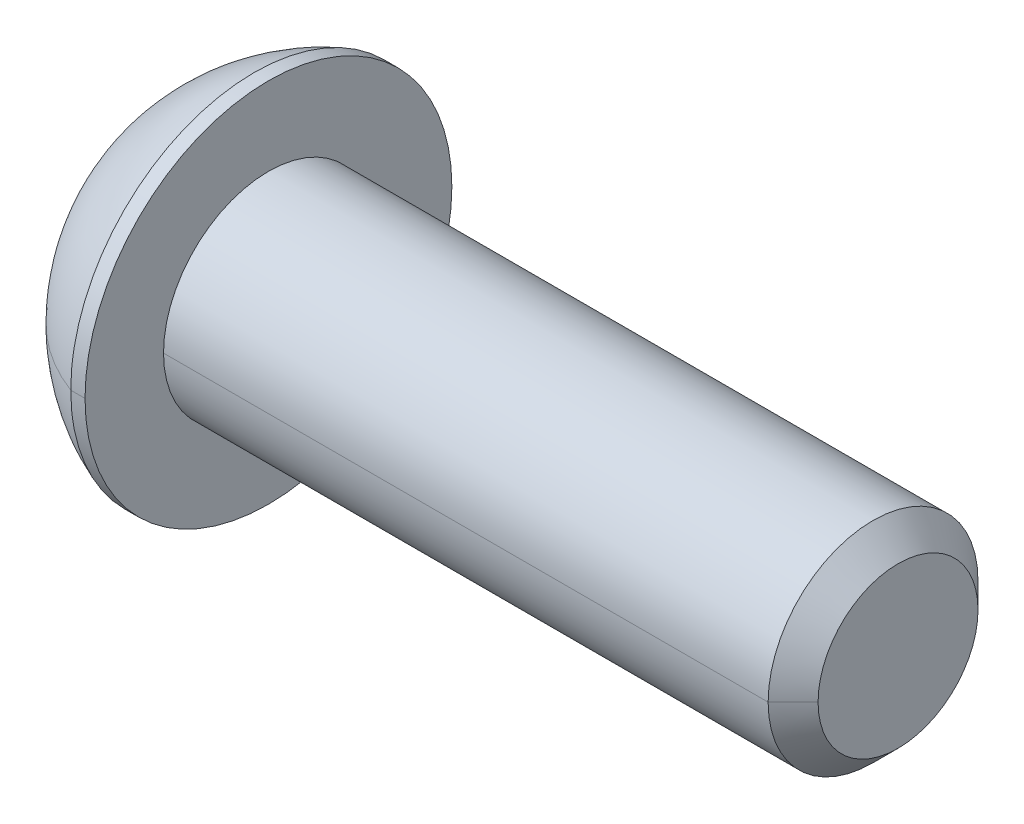
ISO-10303-21;
HEADER;
FILE_DESCRIPTION(('STEP AP214'),'2;1');
FILE_NAME('part.step','',(''),(''),'','','');
FILE_SCHEMA(('AUTOMOTIVE_DESIGN { 1 0 10303 214 1 1 1 1 }'));
ENDSEC;
DATA;
#1=APPLICATION_CONTEXT('core data for automotive mechanical design processes');
#2=APPLICATION_PROTOCOL_DEFINITION('international standard','automotive_design',2000,#1);
#3=PRODUCT_CONTEXT('',#1,'mechanical');
#4=PRODUCT('Part','Part','',(#3));
#5=PRODUCT_RELATED_PRODUCT_CATEGORY('part','',(#4));
#6=PRODUCT_DEFINITION_FORMATION('','',#4);
#7=PRODUCT_DEFINITION_CONTEXT('part definition',#1,'design');
#8=PRODUCT_DEFINITION('design','',#6,#7);
#9=PRODUCT_DEFINITION_SHAPE('','',#8);
#10=(LENGTH_UNIT() NAMED_UNIT(*) SI_UNIT(.MILLI.,.METRE.));
#11=(NAMED_UNIT(*) PLANE_ANGLE_UNIT() SI_UNIT($,.RADIAN.));
#12=(NAMED_UNIT(*) SI_UNIT($,.STERADIAN.) SOLID_ANGLE_UNIT());
#13=UNCERTAINTY_MEASURE_WITH_UNIT(LENGTH_MEASURE(1.E-05),#10,'distance_accuracy_value','');
#14=(GEOMETRIC_REPRESENTATION_CONTEXT(3) GLOBAL_UNCERTAINTY_ASSIGNED_CONTEXT((#13)) GLOBAL_UNIT_ASSIGNED_CONTEXT((#10,
#11,#12)) REPRESENTATION_CONTEXT('',''));
#15=CARTESIAN_POINT('',(0.,0.,0.));
#16=DIRECTION('',(0.,0.,1.));
#17=DIRECTION('',(1.,0.,0.));
#18=AXIS2_PLACEMENT_3D('',#15,#16,#17);
#19=CARTESIAN_POINT('',(-1.1303,0.,-2.2913588808463));
#20=DIRECTION('',(0.,-0.499999999999979,0.866025403784451));
#21=DIRECTION('',(0.,-0.866025403784451,-0.499999999999979));
#22=AXIS2_PLACEMENT_3D('',#19,#20,#21);
#23=PLANE('',#22);
#24=DIRECTION('',(0.,-0.866025403784451,-0.499999999999979));
#25=VECTOR('',#24,1.);
#26=CARTESIAN_POINT('',(-3.3528,0.992187499999962,-1.71851916063477));
#27=LINE('',#26,#25);
#28=CARTESIAN_POINT('',(-3.3528,1.984375,-1.1456794404232));
#29=VERTEX_POINT('',#28);
#30=CARTESIAN_POINT('',(-3.3528,0.,-2.2913588808463));
#31=VERTEX_POINT('',#30);
#32=EDGE_CURVE('E11',#29,#31,#27,.T.);
#33=ORIENTED_EDGE('',*,*,#32,.T.);
#34=DIRECTION('',(-1.,0.,0.));
#35=VECTOR('',#34,1.);
#36=CARTESIAN_POINT('',(-1.1303,0.,-2.2913588808463));
#37=LINE('',#36,#35);
#38=CARTESIAN_POINT('',(-1.1303,0.,-2.2913588808463));
#39=VERTEX_POINT('',#38);
#40=EDGE_CURVE('E25',#39,#31,#37,.T.);
#41=ORIENTED_EDGE('',*,*,#40,.F.);
#42=DIRECTION('',(0.,0.866025403784451,0.499999999999979));
#43=VECTOR('',#42,1.);
#44=CARTESIAN_POINT('',(-1.1303,0.,-2.2913588808463));
#45=LINE('',#44,#43);
#46=CARTESIAN_POINT('',(-1.1303,1.984375,-1.1456794404232));
#47=VERTEX_POINT('',#46);
#48=EDGE_CURVE('E326',#39,#47,#45,.T.);
#49=ORIENTED_EDGE('',*,*,#48,.T.);
#50=DIRECTION('',(-1.,0.,0.));
#51=VECTOR('',#50,1.);
#52=CARTESIAN_POINT('',(-1.1303,1.984375,-1.1456794404232));
#53=LINE('',#52,#51);
#54=EDGE_CURVE('E322',#47,#29,#53,.T.);
#55=ORIENTED_EDGE('',*,*,#54,.T.);
#56=EDGE_LOOP('',(#33,#41,#49,#55));
#57=FACE_BOUND('',#56,.T.);
#58=ADVANCED_FACE('F17',(#57),#23,.T.);
#59=CARTESIAN_POINT('',(-1.1303,1.984375,-1.1456794404232));
#60=DIRECTION('',(0.,-1.,0.));
#61=DIRECTION('',(0.,0.,-1.));
#62=AXIS2_PLACEMENT_3D('',#59,#60,#61);
#63=PLANE('',#62);
#64=DIRECTION('',(-1.,0.,0.));
#65=VECTOR('',#64,1.);
#66=CARTESIAN_POINT('',(-1.1303,1.984375,1.1456794404232));
#67=LINE('',#66,#65);
#68=CARTESIAN_POINT('',(-1.1303,1.984375,1.1456794404232));
#69=VERTEX_POINT('',#68);
#70=CARTESIAN_POINT('',(-3.3528,1.984375,1.1456794404232));
#71=VERTEX_POINT('',#70);
#72=EDGE_CURVE('E318',#69,#71,#67,.T.);
#73=ORIENTED_EDGE('',*,*,#72,.T.);
#74=DIRECTION('',(0.,0.,-1.));
#75=VECTOR('',#74,1.);
#76=CARTESIAN_POINT('',(-3.3528,1.984375,0.));
#77=LINE('',#76,#75);
#78=EDGE_CURVE('E313',#71,#29,#77,.T.);
#79=ORIENTED_EDGE('',*,*,#78,.T.);
#80=ORIENTED_EDGE('',*,*,#54,.F.);
#81=DIRECTION('',(0.,0.,1.));
#82=VECTOR('',#81,1.);
#83=CARTESIAN_POINT('',(-1.1303,1.984375,-1.1456794404232));
#84=LINE('',#83,#82);
#85=EDGE_CURVE('E309',#47,#69,#84,.T.);
#86=ORIENTED_EDGE('',*,*,#85,.T.);
#87=EDGE_LOOP('',(#73,#79,#80,#86));
#88=FACE_BOUND('',#87,.T.);
#89=ADVANCED_FACE('F359',(#88),#63,.T.);
#90=CARTESIAN_POINT('',(-1.1303,0.,0.));
#91=DIRECTION('',(1.,0.,0.));
#92=DIRECTION('',(0.,0.,-1.));
#93=AXIS2_PLACEMENT_3D('',#90,#91,#92);
#94=PLANE('',#93);
#95=DIRECTION('',(0.,-0.866025403784451,0.499999999999979));
#96=VECTOR('',#95,1.);
#97=CARTESIAN_POINT('',(-1.1303,1.984375,1.1456794404232));
#98=LINE('',#97,#96);
#99=CARTESIAN_POINT('',(-1.1303,0.,2.2913588808463));
#100=VERTEX_POINT('',#99);
#101=EDGE_CURVE('E304',#69,#100,#98,.T.);
#102=ORIENTED_EDGE('',*,*,#101,.F.);
#103=ORIENTED_EDGE('',*,*,#85,.F.);
#104=ORIENTED_EDGE('',*,*,#48,.F.);
#105=DIRECTION('',(0.,0.866025403784451,-0.499999999999979));
#106=VECTOR('',#105,1.);
#107=CARTESIAN_POINT('',(-1.1303,-1.984375,-1.1456794404232));
#108=LINE('',#107,#106);
#109=CARTESIAN_POINT('',(-1.1303,-1.984375,-1.1456794404232));
#110=VERTEX_POINT('',#109);
#111=EDGE_CURVE('E299',#110,#39,#108,.T.);
#112=ORIENTED_EDGE('',*,*,#111,.F.);
#113=DIRECTION('',(0.,0.,-1.));
#114=VECTOR('',#113,1.);
#115=CARTESIAN_POINT('',(-1.1303,-1.984375,1.1456794404232));
#116=LINE('',#115,#114);
#117=CARTESIAN_POINT('',(-1.1303,-1.984375,1.1456794404232));
#118=VERTEX_POINT('',#117);
#119=EDGE_CURVE('E294',#118,#110,#116,.T.);
#120=ORIENTED_EDGE('',*,*,#119,.F.);
#121=DIRECTION('',(0.,-0.866025403784451,-0.499999999999979));
#122=VECTOR('',#121,1.);
#123=CARTESIAN_POINT('',(-1.1303,0.,2.2913588808463));
#124=LINE('',#123,#122);
#125=EDGE_CURVE('E289',#100,#118,#124,.T.);
#126=ORIENTED_EDGE('',*,*,#125,.F.);
#127=EDGE_LOOP('',(#102,#103,#104,#112,#120,#126));
#128=FACE_BOUND('',#127,.T.);
#129=ADVANCED_FACE('F349',(#128),#94,.F.);
#130=CARTESIAN_POINT('',(-1.1303,0.,2.2913588808463));
#131=DIRECTION('',(0.,0.499999999999979,-0.866025403784451));
#132=DIRECTION('',(0.,0.866025403784451,0.499999999999979));
#133=AXIS2_PLACEMENT_3D('',#130,#131,#132);
#134=PLANE('',#133);
#135=DIRECTION('',(0.,0.866025403784451,0.499999999999979));
#136=VECTOR('',#135,1.);
#137=CARTESIAN_POINT('',(-3.3528,-0.992187499999962,1.71851916063477));
#138=LINE('',#137,#136);
#139=CARTESIAN_POINT('',(-3.3528,-1.984375,1.1456794404232));
#140=VERTEX_POINT('',#139);
#141=CARTESIAN_POINT('',(-3.3528,0.,2.2913588808463));
#142=VERTEX_POINT('',#141);
#143=EDGE_CURVE('E285',#140,#142,#138,.T.);
#144=ORIENTED_EDGE('',*,*,#143,.T.);
#145=DIRECTION('',(-1.,0.,0.));
#146=VECTOR('',#145,1.);
#147=CARTESIAN_POINT('',(-1.1303,0.,2.2913588808463));
#148=LINE('',#147,#146);
#149=EDGE_CURVE('E280',#100,#142,#148,.T.);
#150=ORIENTED_EDGE('',*,*,#149,.F.);
#151=ORIENTED_EDGE('',*,*,#125,.T.);
#152=DIRECTION('',(-1.,0.,0.));
#153=VECTOR('',#152,1.);
#154=CARTESIAN_POINT('',(-1.1303,-1.984375,1.1456794404232));
#155=LINE('',#154,#153);
#156=EDGE_CURVE('E276',#118,#140,#155,.T.);
#157=ORIENTED_EDGE('',*,*,#156,.T.);
#158=EDGE_LOOP('',(#144,#150,#151,#157));
#159=FACE_BOUND('',#158,.T.);
#160=ADVANCED_FACE('F352',(#159),#134,.T.);
#161=CARTESIAN_POINT('',(-1.1303,-1.984375,1.1456794404232));
#162=DIRECTION('',(0.,1.,0.));
#163=DIRECTION('',(0.,0.,1.));
#164=AXIS2_PLACEMENT_3D('',#161,#162,#163);
#165=PLANE('',#164);
#166=DIRECTION('',(0.,0.,1.));
#167=VECTOR('',#166,1.);
#168=CARTESIAN_POINT('',(-3.3528,-1.984375,0.));
#169=LINE('',#168,#167);
#170=CARTESIAN_POINT('',(-3.3528,-1.984375,-1.1456794404232));
#171=VERTEX_POINT('',#170);
#172=EDGE_CURVE('E271',#171,#140,#169,.T.);
#173=ORIENTED_EDGE('',*,*,#172,.T.);
#174=ORIENTED_EDGE('',*,*,#156,.F.);
#175=ORIENTED_EDGE('',*,*,#119,.T.);
#176=DIRECTION('',(-1.,0.,0.));
#177=VECTOR('',#176,1.);
#178=CARTESIAN_POINT('',(-1.1303,-1.984375,-1.1456794404232));
#179=LINE('',#178,#177);
#180=EDGE_CURVE('E267',#110,#171,#179,.T.);
#181=ORIENTED_EDGE('',*,*,#180,.T.);
#182=EDGE_LOOP('',(#173,#174,#175,#181));
#183=FACE_BOUND('',#182,.T.);
#184=ADVANCED_FACE('F346',(#183),#165,.T.);
#185=CARTESIAN_POINT('',(-1.1303,-1.984375,-1.1456794404232));
#186=DIRECTION('',(0.,0.499999999999979,0.866025403784451));
#187=DIRECTION('',(0.,-0.866025403784451,0.499999999999979));
#188=AXIS2_PLACEMENT_3D('',#185,#186,#187);
#189=PLANE('',#188);
#190=DIRECTION('',(0.,-0.866025403784451,0.499999999999979));
#191=VECTOR('',#190,1.);
#192=CARTESIAN_POINT('',(-3.3528,-0.992187499999962,-1.71851916063477));
#193=LINE('',#192,#191);
#194=EDGE_CURVE('E262',#31,#171,#193,.T.);
#195=ORIENTED_EDGE('',*,*,#194,.T.);
#196=ORIENTED_EDGE('',*,*,#180,.F.);
#197=ORIENTED_EDGE('',*,*,#111,.T.);
#198=ORIENTED_EDGE('',*,*,#40,.T.);
#199=EDGE_LOOP('',(#195,#196,#197,#198));
#200=FACE_BOUND('',#199,.T.);
#201=ADVANCED_FACE('F336',(#200),#189,.T.);
#202=CARTESIAN_POINT('',(-3.3528,0.,0.));
#203=DIRECTION('',(1.,0.,0.));
#204=DIRECTION('',(0.,0.,-1.));
#205=AXIS2_PLACEMENT_3D('',#202,#203,#204);
#206=PLANE('',#205);
#207=CARTESIAN_POINT('',(-3.3528,0.,0.));
#208=DIRECTION('',(1.,0.,0.));
#209=DIRECTION('',(0.,0.,-1.));
#210=AXIS2_PLACEMENT_3D('',#207,#208,#209);
#211=CIRCLE('',#210,3.175);
#212=CARTESIAN_POINT('',(-3.3528,0.,-3.175));
#213=VERTEX_POINT('',#212);
#214=CARTESIAN_POINT('',(-3.3528,0.,3.175));
#215=VERTEX_POINT('',#214);
#216=EDGE_CURVE('E258',#213,#215,#211,.T.);
#217=ORIENTED_EDGE('',*,*,#216,.F.);
#218=CARTESIAN_POINT('',(-3.3528,0.,0.));
#219=DIRECTION('',(1.,0.,0.));
#220=DIRECTION('',(0.,0.,-1.));
#221=AXIS2_PLACEMENT_3D('',#218,#219,#220);
#222=CIRCLE('',#221,3.175);
#223=EDGE_CURVE('E254',#215,#213,#222,.T.);
#224=ORIENTED_EDGE('',*,*,#223,.F.);
#225=EDGE_LOOP('',(#217,#224));
#226=FACE_BOUND('',#225,.T.);
#227=DIRECTION('',(0.,0.866025403784451,-0.499999999999979));
#228=VECTOR('',#227,1.);
#229=CARTESIAN_POINT('',(-3.3528,0.992187499999962,1.71851916063477));
#230=LINE('',#229,#228);
#231=EDGE_CURVE('E251',#142,#71,#230,.T.);
#232=ORIENTED_EDGE('',*,*,#231,.F.);
#233=ORIENTED_EDGE('',*,*,#143,.F.);
#234=ORIENTED_EDGE('',*,*,#172,.F.);
#235=ORIENTED_EDGE('',*,*,#194,.F.);
#236=ORIENTED_EDGE('',*,*,#32,.F.);
#237=ORIENTED_EDGE('',*,*,#78,.F.);
#238=EDGE_LOOP('',(#232,#233,#234,#235,#236,#237));
#239=FACE_BOUND('',#238,.T.);
#240=ADVANCED_FACE('F341',(#226,#239),#206,.F.);
#241=CARTESIAN_POINT('',(-1.1303,1.984375,1.1456794404232));
#242=DIRECTION('',(0.,-0.499999999999979,-0.866025403784451));
#243=DIRECTION('',(0.,0.866025403784451,-0.499999999999979));
#244=AXIS2_PLACEMENT_3D('',#241,#242,#243);
#245=PLANE('',#244);
#246=ORIENTED_EDGE('',*,*,#231,.T.);
#247=ORIENTED_EDGE('',*,*,#72,.F.);
#248=ORIENTED_EDGE('',*,*,#101,.T.);
#249=ORIENTED_EDGE('',*,*,#149,.T.);
#250=EDGE_LOOP('',(#246,#247,#248,#249));
#251=FACE_BOUND('',#250,.T.);
#252=ADVANCED_FACE('F355',(#251),#245,.T.);
#253=CARTESIAN_POINT('',(-0.431800000000002,0.,5.5499));
#254=CARTESIAN_POINT('',(-0.431800000000002,-11.0998,5.5499));
#255=CARTESIAN_POINT('',(-0.431800000000002,-11.0998,-5.5499));
#256=CARTESIAN_POINT('',(-0.4318,0.,-5.5499));
#257=CARTESIAN_POINT('',(-1.648820554803,0.,5.09324499015708));
#258=CARTESIAN_POINT('',(-1.648820554803,-10.1864899803141,5.09324499015708));
#259=CARTESIAN_POINT('',(-1.648820554803,-10.1864899803141,-5.09324499015708));
#260=CARTESIAN_POINT('',(-1.648820554803,0.,-5.09324499015708));
#261=CARTESIAN_POINT('',(-2.65740276644937,0.,4.27322380068806));
#262=CARTESIAN_POINT('',(-2.65740276644937,-8.54644760137615,4.27322380068806));
#263=CARTESIAN_POINT('',(-2.65740276644937,-8.54644760137615,-4.27322380068806));
#264=CARTESIAN_POINT('',(-2.65740276644937,0.,-4.27322380068806));
#265=CARTESIAN_POINT('',(-3.3528,0.,3.175));
#266=CARTESIAN_POINT('',(-3.3528,-6.35,3.175));
#267=CARTESIAN_POINT('',(-3.3528,-6.35,-3.175));
#268=CARTESIAN_POINT('',(-3.3528,0.,-3.175));
#269=(BOUNDED_SURFACE() B_SPLINE_SURFACE(3,3,((#253,#254,#255,#256),(#257,#258,#259,#260),(#261,
#262,#263,#264),(#265,#266,#267,#268)),.UNSPECIFIED.,.F.,.F.,
.F.) B_SPLINE_SURFACE_WITH_KNOTS((4,4),(4,4),(0.,6.2336188381791),(-54.0740870859098,
-28.4347442817813),
.UNSPECIFIED.) GEOMETRIC_REPRESENTATION_ITEM() RATIONAL_B_SPLINE_SURFACE(((1.,0.333333333333333,
0.333333333333333,1.),(0.965381557817974,0.321793852605991,0.321793852605991,0.965381557817974),
(0.965381557817974,0.321793852605991,0.321793852605991,0.965381557817974),(1.,0.333333333333333,
0.333333333333333,1.))) REPRESENTATION_ITEM('') SURFACE());
#270=CARTESIAN_POINT('',(-0.4318,0.,-5.5499));
#271=CARTESIAN_POINT('',(-1.648820554803,0.,-5.09324499015708));
#272=CARTESIAN_POINT('',(-2.65740276644937,0.,-4.27322380068806));
#273=CARTESIAN_POINT('',(-3.3528,0.,-3.175));
#274=(BOUNDED_CURVE() B_SPLINE_CURVE(3,(#270,#271,#272,#273),.UNSPECIFIED.,.F.,
.F.) B_SPLINE_CURVE_WITH_KNOTS((4,4),(0.,6.2336188381791),
.UNSPECIFIED.) CURVE() GEOMETRIC_REPRESENTATION_ITEM() RATIONAL_B_SPLINE_CURVE((1.,
0.965381557817974,0.965381557817974,1.)) REPRESENTATION_ITEM(''));
#275=CARTESIAN_POINT('',(-0.4318,0.,-5.5499));
#276=VERTEX_POINT('',#275);
#277=EDGE_CURVE('E219',#276,#213,#274,.T.);
#278=CARTESIAN_POINT('',(-0.4318,0.,0.));
#279=DIRECTION('',(1.,0.,0.));
#280=DIRECTION('',(0.,0.,-1.));
#281=AXIS2_PLACEMENT_3D('',#278,#279,#280);
#282=CIRCLE('',#281,5.5499);
#283=CARTESIAN_POINT('',(-0.431800000000003,0.,5.5499));
#284=VERTEX_POINT('',#283);
#285=EDGE_CURVE('E237',#284,#276,#282,.T.);
#286=CARTESIAN_POINT('',(-0.431800000000002,0.,5.5499));
#287=CARTESIAN_POINT('',(-1.648820554803,0.,5.09324499015708));
#288=CARTESIAN_POINT('',(-2.65740276644937,0.,4.27322380068806));
#289=CARTESIAN_POINT('',(-3.3528,0.,3.175));
#290=(BOUNDED_CURVE() B_SPLINE_CURVE(3,(#286,#287,#288,#289),.UNSPECIFIED.,.F.,
.F.) B_SPLINE_CURVE_WITH_KNOTS((4,4),(0.,6.2336188381791),
.UNSPECIFIED.) CURVE() GEOMETRIC_REPRESENTATION_ITEM() RATIONAL_B_SPLINE_CURVE((1.,
0.965381557817974,0.965381557817974,1.)) REPRESENTATION_ITEM(''));
#291=EDGE_CURVE('E222',#284,#215,#290,.T.);
#292=ORIENTED_EDGE('',*,*,#223,.T.);
#293=ORIENTED_EDGE('',*,*,#277,.F.);
#294=ORIENTED_EDGE('',*,*,#285,.F.);
#295=ORIENTED_EDGE('',*,*,#291,.T.);
#296=EDGE_LOOP('',(#292,#293,#294,#295));
#297=FACE_BOUND('',#296,.T.);
#298=ADVANCED_FACE('F194',(#297),#269,.T.);
#299=CARTESIAN_POINT('',(-0.4318,0.,-5.5499));
#300=CARTESIAN_POINT('',(-0.431800000000002,11.0998,-5.5499));
#301=CARTESIAN_POINT('',(-0.431800000000002,11.0998,5.5499));
#302=CARTESIAN_POINT('',(-0.431800000000002,0.,5.5499));
#303=CARTESIAN_POINT('',(-1.648820554803,0.,-5.09324499015708));
#304=CARTESIAN_POINT('',(-1.648820554803,10.1864899803141,-5.09324499015708));
#305=CARTESIAN_POINT('',(-1.648820554803,10.1864899803141,5.09324499015708));
#306=CARTESIAN_POINT('',(-1.648820554803,0.,5.09324499015708));
#307=CARTESIAN_POINT('',(-2.65740276644937,0.,-4.27322380068806));
#308=CARTESIAN_POINT('',(-2.65740276644937,8.54644760137615,-4.27322380068806));
#309=CARTESIAN_POINT('',(-2.65740276644937,8.54644760137615,4.27322380068806));
#310=CARTESIAN_POINT('',(-2.65740276644937,0.,4.27322380068806));
#311=CARTESIAN_POINT('',(-3.3528,0.,-3.175));
#312=CARTESIAN_POINT('',(-3.3528,6.35,-3.175));
#313=CARTESIAN_POINT('',(-3.3528,6.35,3.175));
#314=CARTESIAN_POINT('',(-3.3528,0.,3.175));
#315=(BOUNDED_SURFACE() B_SPLINE_SURFACE(3,3,((#299,#300,#301,#302),(#303,#304,#305,#306),(#307,
#308,#309,#310),(#311,#312,#313,#314)),.UNSPECIFIED.,.F.,.F.,
.F.) B_SPLINE_SURFACE_WITH_KNOTS((4,4),(4,4),(0.,6.2336188381791),(-79.7134298900382,
-54.0740870859098),
.UNSPECIFIED.) GEOMETRIC_REPRESENTATION_ITEM() RATIONAL_B_SPLINE_SURFACE(((1.,0.333333333333333,
0.333333333333333,1.),(0.965381557817974,0.321793852605991,0.321793852605991,0.965381557817974),
(0.965381557817974,0.321793852605991,0.321793852605991,0.965381557817974),(1.,0.333333333333333,
0.333333333333333,1.))) REPRESENTATION_ITEM('') SURFACE());
#316=CARTESIAN_POINT('',(-0.4318,0.,0.));
#317=DIRECTION('',(1.,0.,0.));
#318=DIRECTION('',(0.,0.,-1.));
#319=AXIS2_PLACEMENT_3D('',#316,#317,#318);
#320=CIRCLE('',#319,5.5499);
#321=EDGE_CURVE('E172',#276,#284,#320,.T.);
#322=ORIENTED_EDGE('',*,*,#321,.F.);
#323=ORIENTED_EDGE('',*,*,#277,.T.);
#324=ORIENTED_EDGE('',*,*,#216,.T.);
#325=ORIENTED_EDGE('',*,*,#291,.F.);
#326=EDGE_LOOP('',(#322,#323,#324,#325));
#327=FACE_BOUND('',#326,.T.);
#328=ADVANCED_FACE('F181',(#327),#315,.T.);
#329=CARTESIAN_POINT('',(19.05,0.,0.));
#330=DIRECTION('',(-1.,0.,0.));
#331=DIRECTION('',(0.,-1.,0.));
#332=AXIS2_PLACEMENT_3D('',#329,#330,#331);
#333=CYLINDRICAL_SURFACE('',#332,5.5499);
#334=CARTESIAN_POINT('',(0.,0.,0.));
#335=DIRECTION('',(1.,0.,0.));
#336=DIRECTION('',(0.,0.,-1.));
#337=AXIS2_PLACEMENT_3D('',#334,#335,#336);
#338=CIRCLE('',#337,5.5499);
#339=CARTESIAN_POINT('',(0.,0.,-5.5499));
#340=VERTEX_POINT('',#339);
#341=CARTESIAN_POINT('',(0.,0.,5.5499));
#342=VERTEX_POINT('',#341);
#343=EDGE_CURVE('E167',#340,#342,#338,.T.);
#344=ORIENTED_EDGE('',*,*,#343,.F.);
#345=DIRECTION('',(-1.,0.,0.));
#346=VECTOR('',#345,1.);
#347=CARTESIAN_POINT('',(0.,0.,-5.5499));
#348=LINE('',#347,#346);
#349=EDGE_CURVE('E162',#340,#276,#348,.T.);
#350=ORIENTED_EDGE('',*,*,#349,.T.);
#351=ORIENTED_EDGE('',*,*,#321,.T.);
#352=DIRECTION('',(-1.,0.,0.));
#353=VECTOR('',#352,1.);
#354=CARTESIAN_POINT('',(0.,0.,5.5499));
#355=LINE('',#354,#353);
#356=EDGE_CURVE('E157',#342,#284,#355,.T.);
#357=ORIENTED_EDGE('',*,*,#356,.F.);
#358=EDGE_LOOP('',(#344,#350,#351,#357));
#359=FACE_BOUND('',#358,.T.);
#360=ADVANCED_FACE('F193',(#359),#333,.T.);
#361=CARTESIAN_POINT('',(19.05,0.,0.));
#362=DIRECTION('',(-1.,0.,0.));
#363=DIRECTION('',(0.,1.,0.));
#364=AXIS2_PLACEMENT_3D('',#361,#362,#363);
#365=CYLINDRICAL_SURFACE('',#364,5.5499);
#366=ORIENTED_EDGE('',*,*,#285,.T.);
#367=ORIENTED_EDGE('',*,*,#349,.F.);
#368=CARTESIAN_POINT('',(0.,0.,0.));
#369=DIRECTION('',(1.,0.,0.));
#370=DIRECTION('',(0.,0.,-1.));
#371=AXIS2_PLACEMENT_3D('',#368,#369,#370);
#372=CIRCLE('',#371,5.5499);
#373=EDGE_CURVE('E152',#342,#340,#372,.T.);
#374=ORIENTED_EDGE('',*,*,#373,.F.);
#375=ORIENTED_EDGE('',*,*,#356,.T.);
#376=EDGE_LOOP('',(#366,#367,#374,#375));
#377=FACE_BOUND('',#376,.T.);
#378=ADVANCED_FACE('F388',(#377),#365,.T.);
#379=CARTESIAN_POINT('',(0.,5.5499,0.));
#380=DIRECTION('',(-1.,0.,0.));
#381=DIRECTION('',(0.,0.,1.));
#382=AXIS2_PLACEMENT_3D('',#379,#380,#381);
#383=PLANE('',#382);
#384=CARTESIAN_POINT('',(0.,0.,0.));
#385=DIRECTION('',(1.,0.,0.));
#386=DIRECTION('',(0.,0.,-1.));
#387=AXIS2_PLACEMENT_3D('',#384,#385,#386);
#388=CIRCLE('',#387,3.175);
#389=CARTESIAN_POINT('',(0.,0.,-3.175));
#390=VERTEX_POINT('',#389);
#391=CARTESIAN_POINT('',(0.,0.,3.175));
#392=VERTEX_POINT('',#391);
#393=EDGE_CURVE('E147',#390,#392,#388,.T.);
#394=ORIENTED_EDGE('',*,*,#393,.F.);
#395=CARTESIAN_POINT('',(0.,0.,0.));
#396=DIRECTION('',(1.,0.,0.));
#397=DIRECTION('',(0.,0.,-1.));
#398=AXIS2_PLACEMENT_3D('',#395,#396,#397);
#399=CIRCLE('',#398,3.175);
#400=EDGE_CURVE('E142',#392,#390,#399,.T.);
#401=ORIENTED_EDGE('',*,*,#400,.F.);
#402=EDGE_LOOP('',(#394,#401));
#403=FACE_BOUND('',#402,.T.);
#404=ORIENTED_EDGE('',*,*,#343,.T.);
#405=ORIENTED_EDGE('',*,*,#373,.T.);
#406=EDGE_LOOP('',(#404,#405));
#407=FACE_BOUND('',#406,.T.);
#408=ADVANCED_FACE('F390',(#403,#407),#383,.F.);
#409=CARTESIAN_POINT('',(19.05,0.,0.));
#410=DIRECTION('',(-1.,0.,0.));
#411=DIRECTION('',(0.,1.,0.));
#412=AXIS2_PLACEMENT_3D('',#409,#410,#411);
#413=CYLINDRICAL_SURFACE('',#412,3.175);
#414=ORIENTED_EDGE('',*,*,#400,.T.);
#415=DIRECTION('',(-1.,0.,0.));
#416=VECTOR('',#415,1.);
#417=CARTESIAN_POINT('',(18.29435,0.,-3.175));
#418=LINE('',#417,#416);
#419=CARTESIAN_POINT('',(18.29435,0.,-3.175));
#420=VERTEX_POINT('',#419);
#421=EDGE_CURVE('E137',#420,#390,#418,.T.);
#422=ORIENTED_EDGE('',*,*,#421,.F.);
#423=CARTESIAN_POINT('',(18.29435,0.,0.));
#424=DIRECTION('',(1.,0.,0.));
#425=DIRECTION('',(0.,0.,-1.));
#426=AXIS2_PLACEMENT_3D('',#423,#424,#425);
#427=CIRCLE('',#426,3.175);
#428=CARTESIAN_POINT('',(18.29435,0.,3.175));
#429=VERTEX_POINT('',#428);
#430=EDGE_CURVE('E133',#429,#420,#427,.T.);
#431=ORIENTED_EDGE('',*,*,#430,.F.);
#432=DIRECTION('',(-1.,0.,0.));
#433=VECTOR('',#432,1.);
#434=CARTESIAN_POINT('',(18.29435,0.,3.175));
#435=LINE('',#434,#433);
#436=EDGE_CURVE('E121',#429,#392,#435,.T.);
#437=ORIENTED_EDGE('',*,*,#436,.T.);
#438=EDGE_LOOP('',(#414,#422,#431,#437));
#439=FACE_BOUND('',#438,.T.);
#440=ADVANCED_FACE('F392',(#439),#413,.T.);
#441=CARTESIAN_POINT('',(19.05,0.,0.));
#442=DIRECTION('',(-1.,0.,0.));
#443=DIRECTION('',(0.,-1.,0.));
#444=AXIS2_PLACEMENT_3D('',#441,#442,#443);
#445=CYLINDRICAL_SURFACE('',#444,3.175);
#446=CARTESIAN_POINT('',(18.29435,0.,0.));
#447=DIRECTION('',(1.,0.,0.));
#448=DIRECTION('',(0.,0.,-1.));
#449=AXIS2_PLACEMENT_3D('',#446,#447,#448);
#450=CIRCLE('',#449,3.175);
#451=EDGE_CURVE('E109',#420,#429,#450,.T.);
#452=ORIENTED_EDGE('',*,*,#451,.F.);
#453=ORIENTED_EDGE('',*,*,#421,.T.);
#454=ORIENTED_EDGE('',*,*,#393,.T.);
#455=ORIENTED_EDGE('',*,*,#436,.F.);
#456=EDGE_LOOP('',(#452,#453,#454,#455));
#457=FACE_BOUND('',#456,.T.);
#458=ADVANCED_FACE('F399',(#457),#445,.T.);
#459=CARTESIAN_POINT('',(18.29435,0.,0.));
#460=DIRECTION('',(-1.,0.,0.));
#461=DIRECTION('',(0.,-1.,0.));
#462=AXIS2_PLACEMENT_3D('',#459,#460,#461);
#463=CONICAL_SURFACE('',#462,3.175,0.7853981634);
#464=CARTESIAN_POINT('',(19.05,0.,0.));
#465=DIRECTION('',(1.,0.,0.));
#466=DIRECTION('',(0.,0.,-1.));
#467=AXIS2_PLACEMENT_3D('',#464,#465,#466);
#468=CIRCLE('',#467,2.41935);
#469=CARTESIAN_POINT('',(19.05,0.,-2.41935));
#470=VERTEX_POINT('',#469);
#471=CARTESIAN_POINT('',(19.0499999999981,0.,2.41934999999807));
#472=VERTEX_POINT('',#471);
#473=EDGE_CURVE('E106',#470,#472,#468,.T.);
#474=ORIENTED_EDGE('',*,*,#473,.F.);
#475=DIRECTION('',(-0.707106781184743,0.,-0.707106781188352));
#476=VECTOR('',#475,1.);
#477=CARTESIAN_POINT('',(19.0499999999981,0.,-2.41934999999807));
#478=LINE('',#477,#476);
#479=EDGE_CURVE('E112',#470,#420,#478,.T.);
#480=ORIENTED_EDGE('',*,*,#479,.T.);
#481=ORIENTED_EDGE('',*,*,#451,.T.);
#482=DIRECTION('',(-0.707106781184743,0.,0.707106781188352));
#483=VECTOR('',#482,1.);
#484=CARTESIAN_POINT('',(19.0499999999981,0.,2.41934999999807));
#485=LINE('',#484,#483);
#486=EDGE_CURVE('E101',#472,#429,#485,.T.);
#487=ORIENTED_EDGE('',*,*,#486,.F.);
#488=EDGE_LOOP('',(#474,#480,#481,#487));
#489=FACE_BOUND('',#488,.T.);
#490=ADVANCED_FACE('F103',(#489),#463,.T.);
#491=CARTESIAN_POINT('',(18.29435,0.,0.));
#492=DIRECTION('',(-1.,0.,0.));
#493=DIRECTION('',(0.,1.,0.));
#494=AXIS2_PLACEMENT_3D('',#491,#492,#493);
#495=CONICAL_SURFACE('',#494,3.175,0.7853981634);
#496=ORIENTED_EDGE('',*,*,#430,.T.);
#497=ORIENTED_EDGE('',*,*,#479,.F.);
#498=CARTESIAN_POINT('',(19.05,0.,0.));
#499=DIRECTION('',(1.,0.,0.));
#500=DIRECTION('',(0.,0.,-1.));
#501=AXIS2_PLACEMENT_3D('',#498,#499,#500);
#502=CIRCLE('',#501,2.41935);
#503=EDGE_CURVE('E113',#472,#470,#502,.T.);
#504=ORIENTED_EDGE('',*,*,#503,.F.);
#505=ORIENTED_EDGE('',*,*,#486,.T.);
#506=EDGE_LOOP('',(#496,#497,#504,#505));
#507=FACE_BOUND('',#506,.T.);
#508=ADVANCED_FACE('F116',(#507),#495,.T.);
#509=CARTESIAN_POINT('',(19.05,2.41935,0.));
#510=DIRECTION('',(-1.,0.,0.));
#511=DIRECTION('',(0.,0.,1.));
#512=AXIS2_PLACEMENT_3D('',#509,#510,#511);
#513=PLANE('',#512);
#514=ORIENTED_EDGE('',*,*,#473,.T.);
#515=ORIENTED_EDGE('',*,*,#503,.T.);
#516=EDGE_LOOP('',(#514,#515));
#517=FACE_BOUND('',#516,.T.);
#518=ADVANCED_FACE('F119',(#517),#513,.F.);
#519=CLOSED_SHELL('',(#58,#89,#129,#160,#184,#201,#240,#252,#298,#328,#360,#378,#408,#440,#458,
#490,#508,#518));
#520=MANIFOLD_SOLID_BREP('B1',#519);
#521=ADVANCED_BREP_SHAPE_REPRESENTATION('',(#18,#520),#14);
#522=SHAPE_DEFINITION_REPRESENTATION(#9,#521);
ENDSEC;
END-ISO-10303-21;
